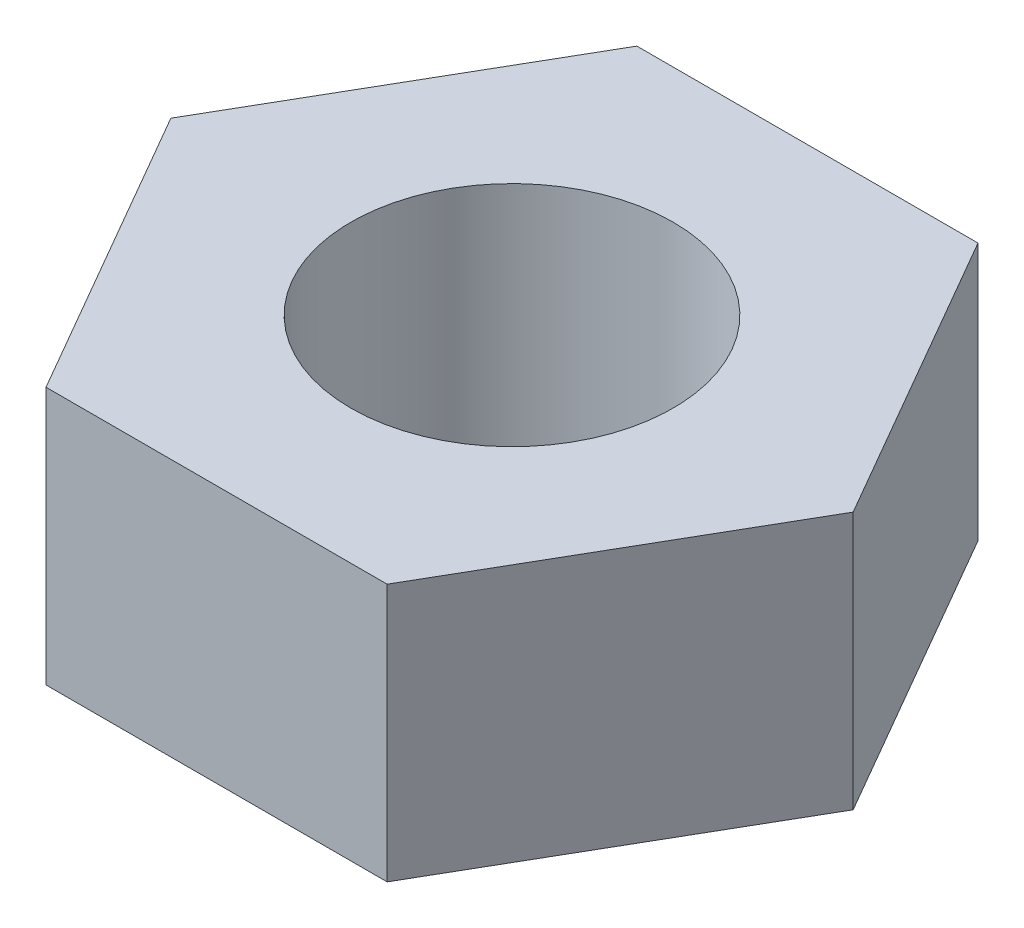
ISO-10303-21;
HEADER;
FILE_DESCRIPTION(('STEP AP214'),'2;1');
FILE_NAME('part.step','',(''),(''),'','','');
FILE_SCHEMA(('AUTOMOTIVE_DESIGN { 1 0 10303 214 1 1 1 1 }'));
ENDSEC;
DATA;
#1=APPLICATION_CONTEXT('core data for automotive mechanical design processes');
#2=APPLICATION_PROTOCOL_DEFINITION('international standard','automotive_design',2000,#1);
#3=PRODUCT_CONTEXT('',#1,'mechanical');
#4=PRODUCT('Part','Part','',(#3));
#5=PRODUCT_RELATED_PRODUCT_CATEGORY('part','',(#4));
#6=PRODUCT_DEFINITION_FORMATION('','',#4);
#7=PRODUCT_DEFINITION_CONTEXT('part definition',#1,'design');
#8=PRODUCT_DEFINITION('design','',#6,#7);
#9=PRODUCT_DEFINITION_SHAPE('','',#8);
#10=(LENGTH_UNIT() NAMED_UNIT(*) SI_UNIT(.MILLI.,.METRE.));
#11=(NAMED_UNIT(*) PLANE_ANGLE_UNIT() SI_UNIT($,.RADIAN.));
#12=(NAMED_UNIT(*) SI_UNIT($,.STERADIAN.) SOLID_ANGLE_UNIT());
#13=UNCERTAINTY_MEASURE_WITH_UNIT(LENGTH_MEASURE(1.E-05),#10,'distance_accuracy_value','');
#14=(GEOMETRIC_REPRESENTATION_CONTEXT(3) GLOBAL_UNCERTAINTY_ASSIGNED_CONTEXT((#13)) GLOBAL_UNIT_ASSIGNED_CONTEXT((#10,
#11,#12)) REPRESENTATION_CONTEXT('',''));
#15=CARTESIAN_POINT('',(0.,0.,0.));
#16=DIRECTION('',(0.,0.,1.));
#17=DIRECTION('',(1.,0.,0.));
#18=AXIS2_PLACEMENT_3D('',#15,#16,#17);
#19=CARTESIAN_POINT('',(0.,2.4,0.));
#20=DIRECTION('',(0.,1.,0.));
#21=DIRECTION('',(0.,0.,1.));
#22=AXIS2_PLACEMENT_3D('',#19,#20,#21);
#23=PLANE('',#22);
#24=DIRECTION('',(0.499999999999995,0.,-0.866025403784442));
#25=VECTOR('',#24,1.);
#26=CARTESIAN_POINT('',(1.5877132402715,2.4,2.74999999999998));
#27=LINE('',#26,#25);
#28=CARTESIAN_POINT('',(1.5877132402715,2.4,2.74999999999998));
#29=VERTEX_POINT('',#28);
#30=CARTESIAN_POINT('',(3.17542648054294,2.4,0.));
#31=VERTEX_POINT('',#30);
#32=EDGE_CURVE('E128',#29,#31,#27,.T.);
#33=ORIENTED_EDGE('',*,*,#32,.T.);
#34=DIRECTION('',(-0.500000000000001,0.,-0.866025403784438));
#35=VECTOR('',#34,1.);
#36=CARTESIAN_POINT('',(3.17542648054294,2.4,0.));
#37=LINE('',#36,#35);
#38=CARTESIAN_POINT('',(1.58771324027146,2.4,-2.75));
#39=VERTEX_POINT('',#38);
#40=EDGE_CURVE('E86',#31,#39,#37,.T.);
#41=ORIENTED_EDGE('',*,*,#40,.T.);
#42=DIRECTION('',(-1.,0.,0.));
#43=VECTOR('',#42,1.);
#44=CARTESIAN_POINT('',(1.58771324027146,2.4,-2.75));
#45=LINE('',#44,#43);
#46=CARTESIAN_POINT('',(-1.58771324027148,2.4,-2.74999999999999));
#47=VERTEX_POINT('',#46);
#48=EDGE_CURVE('E99',#39,#47,#45,.T.);
#49=ORIENTED_EDGE('',*,*,#48,.T.);
#50=DIRECTION('',(-0.499999999999995,0.,0.866025403784441));
#51=VECTOR('',#50,1.);
#52=CARTESIAN_POINT('',(-1.58771324027148,2.4,-2.74999999999999));
#53=LINE('',#52,#51);
#54=CARTESIAN_POINT('',(-3.17542648054294,2.4,0.));
#55=VERTEX_POINT('',#54);
#56=EDGE_CURVE('E93',#47,#55,#53,.T.);
#57=ORIENTED_EDGE('',*,*,#56,.T.);
#58=DIRECTION('',(0.500000000000007,0.,0.866025403784434));
#59=VECTOR('',#58,1.);
#60=CARTESIAN_POINT('',(-3.17542648054294,2.4,0.));
#61=LINE('',#60,#59);
#62=CARTESIAN_POINT('',(-1.58771324027144,2.4,2.75000000000001));
#63=VERTEX_POINT('',#62);
#64=EDGE_CURVE('E97',#55,#63,#61,.T.);
#65=ORIENTED_EDGE('',*,*,#64,.T.);
#66=DIRECTION('',(1.,0.,0.));
#67=VECTOR('',#66,1.);
#68=CARTESIAN_POINT('',(-1.58771324027144,2.4,2.75000000000001));
#69=LINE('',#68,#67);
#70=EDGE_CURVE('E49',#63,#29,#69,.T.);
#71=ORIENTED_EDGE('',*,*,#70,.T.);
#72=EDGE_LOOP('',(#33,#41,#49,#57,#65,#71));
#73=FACE_BOUND('',#72,.T.);
#74=CARTESIAN_POINT('',(0.,2.4,0.));
#75=DIRECTION('',(0.,1.,0.));
#76=DIRECTION('',(0.,0.,1.));
#77=AXIS2_PLACEMENT_3D('',#74,#75,#76);
#78=CIRCLE('',#77,1.5);
#79=CARTESIAN_POINT('',(0.,2.4,1.5));
#80=VERTEX_POINT('',#79);
#81=EDGE_CURVE('E121',#80,#80,#78,.T.);
#82=ORIENTED_EDGE('',*,*,#81,.F.);
#83=EDGE_LOOP('',(#82));
#84=FACE_BOUND('',#83,.T.);
#85=ADVANCED_FACE('F32',(#73,#84),#23,.T.);
#86=CARTESIAN_POINT('',(0.,0.,0.));
#87=DIRECTION('',(0.,1.,0.));
#88=DIRECTION('',(0.,0.,1.));
#89=AXIS2_PLACEMENT_3D('',#86,#87,#88);
#90=PLANE('',#89);
#91=DIRECTION('',(0.499999999999995,0.,-0.866025403784442));
#92=VECTOR('',#91,1.);
#93=CARTESIAN_POINT('',(1.5877132402715,0.,2.74999999999998));
#94=LINE('',#93,#92);
#95=CARTESIAN_POINT('',(1.5877132402715,0.,2.74999999999998));
#96=VERTEX_POINT('',#95);
#97=CARTESIAN_POINT('',(3.17542648054294,0.,0.));
#98=VERTEX_POINT('',#97);
#99=EDGE_CURVE('E117',#96,#98,#94,.T.);
#100=ORIENTED_EDGE('',*,*,#99,.F.);
#101=DIRECTION('',(1.,0.,0.));
#102=VECTOR('',#101,1.);
#103=CARTESIAN_POINT('',(-1.58771324027144,0.,2.75000000000001));
#104=LINE('',#103,#102);
#105=CARTESIAN_POINT('',(-1.58771324027144,0.,2.75000000000001));
#106=VERTEX_POINT('',#105);
#107=EDGE_CURVE('E78',#106,#96,#104,.T.);
#108=ORIENTED_EDGE('',*,*,#107,.F.);
#109=DIRECTION('',(0.500000000000007,0.,0.866025403784434));
#110=VECTOR('',#109,1.);
#111=CARTESIAN_POINT('',(-3.17542648054294,0.,0.));
#112=LINE('',#111,#110);
#113=CARTESIAN_POINT('',(-3.17542648054294,0.,0.));
#114=VERTEX_POINT('',#113);
#115=EDGE_CURVE('E72',#114,#106,#112,.T.);
#116=ORIENTED_EDGE('',*,*,#115,.F.);
#117=DIRECTION('',(-0.499999999999995,0.,0.866025403784441));
#118=VECTOR('',#117,1.);
#119=CARTESIAN_POINT('',(-1.58771324027148,0.,-2.74999999999999));
#120=LINE('',#119,#118);
#121=CARTESIAN_POINT('',(-1.58771324027148,0.,-2.74999999999999));
#122=VERTEX_POINT('',#121);
#123=EDGE_CURVE('E107',#122,#114,#120,.T.);
#124=ORIENTED_EDGE('',*,*,#123,.F.);
#125=DIRECTION('',(-1.,0.,0.));
#126=VECTOR('',#125,1.);
#127=CARTESIAN_POINT('',(1.58771324027146,0.,-2.75));
#128=LINE('',#127,#126);
#129=CARTESIAN_POINT('',(1.58771324027146,0.,-2.75));
#130=VERTEX_POINT('',#129);
#131=EDGE_CURVE('E123',#130,#122,#128,.T.);
#132=ORIENTED_EDGE('',*,*,#131,.F.);
#133=DIRECTION('',(-0.500000000000001,0.,-0.866025403784438));
#134=VECTOR('',#133,1.);
#135=CARTESIAN_POINT('',(3.17542648054294,0.,0.));
#136=LINE('',#135,#134);
#137=EDGE_CURVE('E120',#98,#130,#136,.T.);
#138=ORIENTED_EDGE('',*,*,#137,.F.);
#139=EDGE_LOOP('',(#100,#108,#116,#124,#132,#138));
#140=FACE_BOUND('',#139,.T.);
#141=CARTESIAN_POINT('',(0.,0.,0.));
#142=DIRECTION('',(0.,1.,0.));
#143=DIRECTION('',(0.,0.,1.));
#144=AXIS2_PLACEMENT_3D('',#141,#142,#143);
#145=CIRCLE('',#144,1.5);
#146=CARTESIAN_POINT('',(0.,0.,1.5));
#147=VERTEX_POINT('',#146);
#148=EDGE_CURVE('E221',#147,#147,#145,.T.);
#149=ORIENTED_EDGE('',*,*,#148,.T.);
#150=EDGE_LOOP('',(#149));
#151=FACE_BOUND('',#150,.T.);
#152=ADVANCED_FACE('F137',(#140,#151),#90,.F.);
#153=CARTESIAN_POINT('',(1.5877132402715,2.4,2.74999999999998));
#154=DIRECTION('',(-0.866025403784441,0.,-0.499999999999995));
#155=DIRECTION('',(-0.499999999999995,0.,0.866025403784442));
#156=AXIS2_PLACEMENT_3D('',#153,#154,#155);
#157=PLANE('',#156);
#158=ORIENTED_EDGE('',*,*,#99,.T.);
#159=DIRECTION('',(0.,-1.,0.));
#160=VECTOR('',#159,1.);
#161=CARTESIAN_POINT('',(3.17542648054294,2.4,0.));
#162=LINE('',#161,#160);
#163=EDGE_CURVE('E11',#31,#98,#162,.T.);
#164=ORIENTED_EDGE('',*,*,#163,.F.);
#165=ORIENTED_EDGE('',*,*,#32,.F.);
#166=DIRECTION('',(0.,-1.,0.));
#167=VECTOR('',#166,1.);
#168=CARTESIAN_POINT('',(1.5877132402715,2.4,2.74999999999998));
#169=LINE('',#168,#167);
#170=EDGE_CURVE('E113',#29,#96,#169,.T.);
#171=ORIENTED_EDGE('',*,*,#170,.T.);
#172=EDGE_LOOP('',(#158,#164,#165,#171));
#173=FACE_BOUND('',#172,.T.);
#174=ADVANCED_FACE('F34',(#173),#157,.F.);
#175=CARTESIAN_POINT('',(3.17542648054294,2.4,0.));
#176=DIRECTION('',(-0.866025403784438,0.,0.500000000000001));
#177=DIRECTION('',(0.500000000000001,0.,0.866025403784438));
#178=AXIS2_PLACEMENT_3D('',#175,#176,#177);
#179=PLANE('',#178);
#180=ORIENTED_EDGE('',*,*,#137,.T.);
#181=DIRECTION('',(0.,-1.,0.));
#182=VECTOR('',#181,1.);
#183=CARTESIAN_POINT('',(1.58771324027146,2.4,-2.75));
#184=LINE('',#183,#182);
#185=EDGE_CURVE('E41',#39,#130,#184,.T.);
#186=ORIENTED_EDGE('',*,*,#185,.F.);
#187=ORIENTED_EDGE('',*,*,#40,.F.);
#188=ORIENTED_EDGE('',*,*,#163,.T.);
#189=EDGE_LOOP('',(#180,#186,#187,#188));
#190=FACE_BOUND('',#189,.T.);
#191=ADVANCED_FACE('F162',(#190),#179,.F.);
#192=CARTESIAN_POINT('',(1.58771324027146,2.4,-2.75));
#193=DIRECTION('',(0.,0.,1.));
#194=DIRECTION('',(1.,0.,0.));
#195=AXIS2_PLACEMENT_3D('',#192,#193,#194);
#196=PLANE('',#195);
#197=ORIENTED_EDGE('',*,*,#131,.T.);
#198=DIRECTION('',(0.,-1.,0.));
#199=VECTOR('',#198,1.);
#200=CARTESIAN_POINT('',(-1.58771324027148,2.4,-2.74999999999999));
#201=LINE('',#200,#199);
#202=EDGE_CURVE('E108',#47,#122,#201,.T.);
#203=ORIENTED_EDGE('',*,*,#202,.F.);
#204=ORIENTED_EDGE('',*,*,#48,.F.);
#205=ORIENTED_EDGE('',*,*,#185,.T.);
#206=EDGE_LOOP('',(#197,#203,#204,#205));
#207=FACE_BOUND('',#206,.T.);
#208=ADVANCED_FACE('F134',(#207),#196,.F.);
#209=CARTESIAN_POINT('',(-1.58771324027148,2.4,-2.74999999999999));
#210=DIRECTION('',(0.866025403784441,0.,0.499999999999995));
#211=DIRECTION('',(0.499999999999995,0.,-0.866025403784442));
#212=AXIS2_PLACEMENT_3D('',#209,#210,#211);
#213=PLANE('',#212);
#214=ORIENTED_EDGE('',*,*,#123,.T.);
#215=DIRECTION('',(0.,-1.,0.));
#216=VECTOR('',#215,1.);
#217=CARTESIAN_POINT('',(-3.17542648054294,2.4,0.));
#218=LINE('',#217,#216);
#219=EDGE_CURVE('E104',#55,#114,#218,.T.);
#220=ORIENTED_EDGE('',*,*,#219,.F.);
#221=ORIENTED_EDGE('',*,*,#56,.F.);
#222=ORIENTED_EDGE('',*,*,#202,.T.);
#223=EDGE_LOOP('',(#214,#220,#221,#222));
#224=FACE_BOUND('',#223,.T.);
#225=ADVANCED_FACE('F105',(#224),#213,.F.);
#226=CARTESIAN_POINT('',(-3.17542648054294,2.4,0.));
#227=DIRECTION('',(0.866025403784434,0.,-0.500000000000007));
#228=DIRECTION('',(-0.500000000000007,0.,-0.866025403784435));
#229=AXIS2_PLACEMENT_3D('',#226,#227,#228);
#230=PLANE('',#229);
#231=ORIENTED_EDGE('',*,*,#115,.T.);
#232=DIRECTION('',(0.,-1.,0.));
#233=VECTOR('',#232,1.);
#234=CARTESIAN_POINT('',(-1.58771324027144,2.4,2.75000000000001));
#235=LINE('',#234,#233);
#236=EDGE_CURVE('E109',#63,#106,#235,.T.);
#237=ORIENTED_EDGE('',*,*,#236,.F.);
#238=ORIENTED_EDGE('',*,*,#64,.F.);
#239=ORIENTED_EDGE('',*,*,#219,.T.);
#240=EDGE_LOOP('',(#231,#237,#238,#239));
#241=FACE_BOUND('',#240,.T.);
#242=ADVANCED_FACE('F111',(#241),#230,.F.);
#243=CARTESIAN_POINT('',(-1.58771324027144,2.4,2.75000000000001));
#244=DIRECTION('',(0.,0.,-1.));
#245=DIRECTION('',(-1.,0.,0.));
#246=AXIS2_PLACEMENT_3D('',#243,#244,#245);
#247=PLANE('',#246);
#248=ORIENTED_EDGE('',*,*,#107,.T.);
#249=ORIENTED_EDGE('',*,*,#170,.F.);
#250=ORIENTED_EDGE('',*,*,#70,.F.);
#251=ORIENTED_EDGE('',*,*,#236,.T.);
#252=EDGE_LOOP('',(#248,#249,#250,#251));
#253=FACE_BOUND('',#252,.T.);
#254=ADVANCED_FACE('F142',(#253),#247,.F.);
#255=CARTESIAN_POINT('',(0.,2.4,0.));
#256=DIRECTION('',(0.,-1.,0.));
#257=DIRECTION('',(0.,0.,-1.));
#258=AXIS2_PLACEMENT_3D('',#255,#256,#257);
#259=CYLINDRICAL_SURFACE('',#258,1.5);
#260=ORIENTED_EDGE('',*,*,#81,.T.);
#261=EDGE_LOOP('',(#260));
#262=FACE_BOUND('',#261,.T.);
#263=ORIENTED_EDGE('',*,*,#148,.F.);
#264=EDGE_LOOP('',(#263));
#265=FACE_BOUND('',#264,.T.);
#266=ADVANCED_FACE('F144',(#262,#265),#259,.F.);
#267=CLOSED_SHELL('',(#85,#152,#174,#191,#208,#225,#242,#254,#266));
#268=MANIFOLD_SOLID_BREP('B2',#267);
#269=ADVANCED_BREP_SHAPE_REPRESENTATION('',(#18,#268),#14);
#270=SHAPE_DEFINITION_REPRESENTATION(#9,#269);
ENDSEC;
END-ISO-10303-21;
